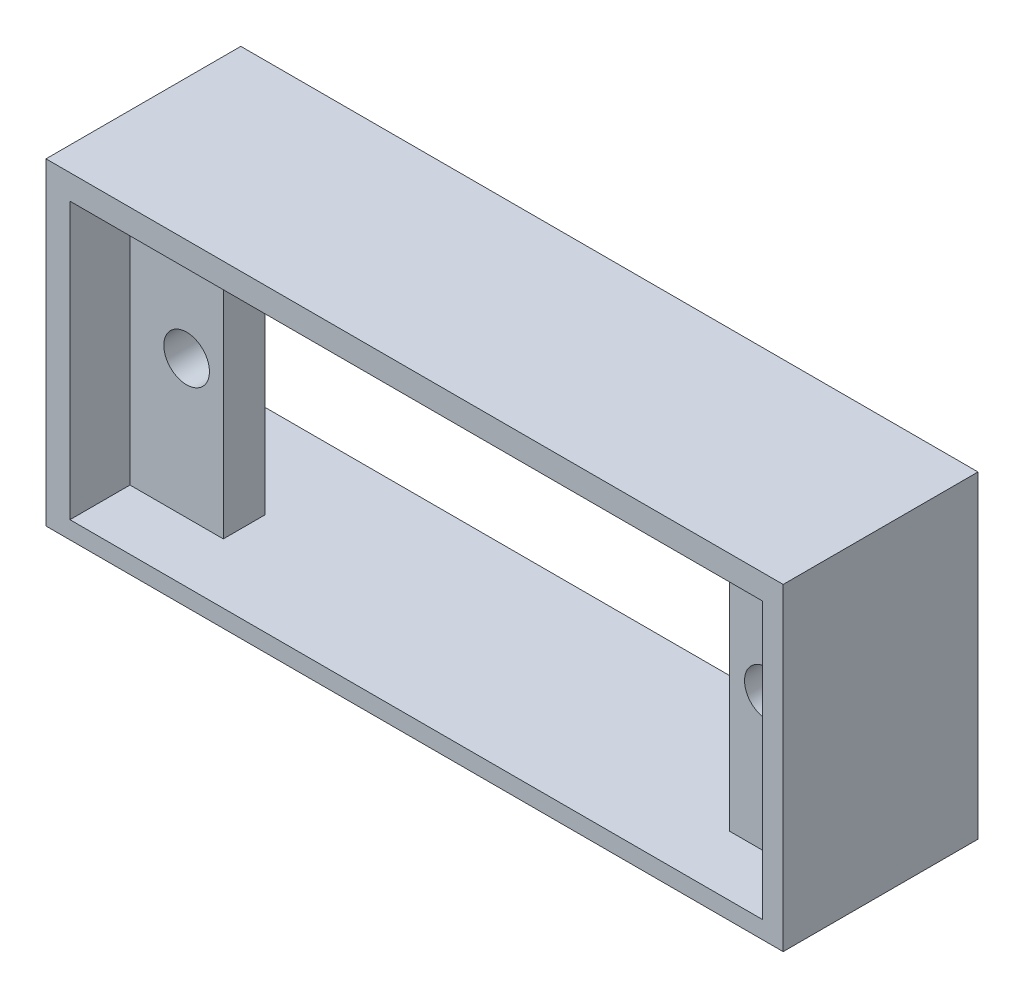
ISO-10303-21;
HEADER;
FILE_DESCRIPTION(('STEP AP214'),'2;1');
FILE_NAME('part.step','',(''),(''),'','','');
FILE_SCHEMA(('AUTOMOTIVE_DESIGN { 1 0 10303 214 1 1 1 1 }'));
ENDSEC;
DATA;
#1=APPLICATION_CONTEXT('core data for automotive mechanical design processes');
#2=APPLICATION_PROTOCOL_DEFINITION('international standard','automotive_design',2000,#1);
#3=PRODUCT_CONTEXT('',#1,'mechanical');
#4=PRODUCT('Part','Part','',(#3));
#5=PRODUCT_RELATED_PRODUCT_CATEGORY('part','',(#4));
#6=PRODUCT_DEFINITION_FORMATION('','',#4);
#7=PRODUCT_DEFINITION_CONTEXT('part definition',#1,'design');
#8=PRODUCT_DEFINITION('design','',#6,#7);
#9=PRODUCT_DEFINITION_SHAPE('','',#8);
#10=(LENGTH_UNIT() NAMED_UNIT(*) SI_UNIT(.MILLI.,.METRE.));
#11=(NAMED_UNIT(*) PLANE_ANGLE_UNIT() SI_UNIT($,.RADIAN.));
#12=(NAMED_UNIT(*) SI_UNIT($,.STERADIAN.) SOLID_ANGLE_UNIT());
#13=UNCERTAINTY_MEASURE_WITH_UNIT(LENGTH_MEASURE(1.E-05),#10,'distance_accuracy_value','');
#14=(GEOMETRIC_REPRESENTATION_CONTEXT(3) GLOBAL_UNCERTAINTY_ASSIGNED_CONTEXT((#13)) GLOBAL_UNIT_ASSIGNED_CONTEXT((#10,
#11,#12)) REPRESENTATION_CONTEXT('',''));
#15=CARTESIAN_POINT('',(0.,0.,0.));
#16=DIRECTION('',(0.,0.,1.));
#17=DIRECTION('',(1.,0.,0.));
#18=AXIS2_PLACEMENT_3D('',#15,#16,#17);
#19=CARTESIAN_POINT('',(0.,0.,0.));
#20=DIRECTION('',(0.,0.,1.));
#21=DIRECTION('',(1.,0.,0.));
#22=AXIS2_PLACEMENT_3D('',#19,#20,#21);
#23=PLANE('',#22);
#24=DIRECTION('',(1.,0.,0.));
#25=VECTOR('',#24,1.);
#26=CARTESIAN_POINT('',(133.519342789879,6.64999999999998,0.));
#27=LINE('',#26,#25);
#28=CARTESIAN_POINT('',(133.519342789879,6.64999999999998,0.));
#29=VERTEX_POINT('',#28);
#30=CARTESIAN_POINT('',(166.919342789878,6.64999999999997,0.));
#31=VERTEX_POINT('',#30);
#32=EDGE_CURVE('E272',#29,#31,#27,.T.);
#33=ORIENTED_EDGE('',*,*,#32,.F.);
#34=DIRECTION('',(0.,1.,0.));
#35=VECTOR('',#34,1.);
#36=CARTESIAN_POINT('',(133.519342789879,-6.65000000000003,0.));
#37=LINE('',#36,#35);
#38=CARTESIAN_POINT('',(133.519342789879,-6.65000000000003,0.));
#39=VERTEX_POINT('',#38);
#40=EDGE_CURVE('E241',#39,#29,#37,.T.);
#41=ORIENTED_EDGE('',*,*,#40,.F.);
#42=DIRECTION('',(-1.,0.,0.));
#43=VECTOR('',#42,1.);
#44=CARTESIAN_POINT('',(133.519342789879,-6.65000000000003,0.));
#45=LINE('',#44,#43);
#46=CARTESIAN_POINT('',(166.919342789878,-6.65000000000003,0.));
#47=VERTEX_POINT('',#46);
#48=EDGE_CURVE('E255',#47,#39,#45,.T.);
#49=ORIENTED_EDGE('',*,*,#48,.F.);
#50=DIRECTION('',(0.,-1.,0.));
#51=VECTOR('',#50,1.);
#52=CARTESIAN_POINT('',(166.919342789878,-6.65000000000003,0.));
#53=LINE('',#52,#51);
#54=EDGE_CURVE('E275',#31,#47,#53,.T.);
#55=ORIENTED_EDGE('',*,*,#54,.F.);
#56=EDGE_LOOP('',(#33,#41,#49,#55));
#57=FACE_BOUND('',#56,.T.);
#58=DIRECTION('',(-1.,0.,0.));
#59=VECTOR('',#58,1.);
#60=CARTESIAN_POINT('',(0.,-7.49377621351169,0.));
#61=LINE('',#60,#59);
#62=CARTESIAN_POINT('',(167.906074817985,-7.49377621351169,0.));
#63=VERTEX_POINT('',#62);
#64=CARTESIAN_POINT('',(132.363269097405,-7.49377621351169,0.));
#65=VERTEX_POINT('',#64);
#66=EDGE_CURVE('E348',#63,#65,#61,.T.);
#67=ORIENTED_EDGE('',*,*,#66,.T.);
#68=DIRECTION('',(0.,-1.,0.));
#69=VECTOR('',#68,1.);
#70=CARTESIAN_POINT('',(132.363269097405,0.,0.));
#71=LINE('',#70,#69);
#72=CARTESIAN_POINT('',(132.363269097405,7.84055344266233,0.));
#73=VERTEX_POINT('',#72);
#74=EDGE_CURVE('E194',#73,#65,#71,.T.);
#75=ORIENTED_EDGE('',*,*,#74,.F.);
#76=DIRECTION('',(-1.,0.,0.));
#77=VECTOR('',#76,1.);
#78=CARTESIAN_POINT('',(0.,7.84055344266233,0.));
#79=LINE('',#78,#77);
#80=CARTESIAN_POINT('',(167.906074817985,7.84055344266233,0.));
#81=VERTEX_POINT('',#80);
#82=EDGE_CURVE('E179',#81,#73,#79,.T.);
#83=ORIENTED_EDGE('',*,*,#82,.F.);
#84=DIRECTION('',(0.,-1.,0.));
#85=VECTOR('',#84,1.);
#86=CARTESIAN_POINT('',(167.906074817985,0.,0.));
#87=LINE('',#86,#85);
#88=EDGE_CURVE('E350',#81,#63,#87,.T.);
#89=ORIENTED_EDGE('',*,*,#88,.T.);
#90=EDGE_LOOP('',(#67,#75,#83,#89));
#91=FACE_BOUND('',#90,.T.);
#92=ADVANCED_FACE('F49',(#57,#91),#23,.F.);
#93=CARTESIAN_POINT('',(138.019342789879,0.,25.));
#94=DIRECTION('',(1.,0.,0.));
#95=DIRECTION('',(0.,0.,-1.));
#96=AXIS2_PLACEMENT_3D('',#93,#94,#95);
#97=PLANE('',#96);
#98=DIRECTION('',(0.,1.,0.));
#99=VECTOR('',#98,1.);
#100=CARTESIAN_POINT('',(138.019342789879,0.,6.5));
#101=LINE('',#100,#99);
#102=CARTESIAN_POINT('',(138.019342789879,-6.65000000000003,6.5));
#103=VERTEX_POINT('',#102);
#104=CARTESIAN_POINT('',(138.019342789879,6.64999999999998,6.5));
#105=VERTEX_POINT('',#104);
#106=EDGE_CURVE('E226',#103,#105,#101,.T.);
#107=ORIENTED_EDGE('',*,*,#106,.F.);
#108=DIRECTION('',(0.,0.,-1.));
#109=VECTOR('',#108,1.);
#110=CARTESIAN_POINT('',(138.019342789879,-6.65000000000003,25.));
#111=LINE('',#110,#109);
#112=CARTESIAN_POINT('',(138.019342789879,-6.65000000000003,4.5));
#113=VERTEX_POINT('',#112);
#114=EDGE_CURVE('E238',#103,#113,#111,.T.);
#115=ORIENTED_EDGE('',*,*,#114,.T.);
#116=DIRECTION('',(0.,-1.,0.));
#117=VECTOR('',#116,1.);
#118=CARTESIAN_POINT('',(138.019342789879,0.,4.5));
#119=LINE('',#118,#117);
#120=CARTESIAN_POINT('',(138.019342789879,6.64999999999998,4.5));
#121=VERTEX_POINT('',#120);
#122=EDGE_CURVE('E299',#121,#113,#119,.T.);
#123=ORIENTED_EDGE('',*,*,#122,.F.);
#124=DIRECTION('',(0.,0.,-1.));
#125=VECTOR('',#124,1.);
#126=CARTESIAN_POINT('',(138.019342789879,6.64999999999998,25.));
#127=LINE('',#126,#125);
#128=EDGE_CURVE('E237',#105,#121,#127,.T.);
#129=ORIENTED_EDGE('',*,*,#128,.F.);
#130=EDGE_LOOP('',(#107,#115,#123,#129));
#131=FACE_BOUND('',#130,.T.);
#132=ADVANCED_FACE('F332',(#131),#97,.T.);
#133=CARTESIAN_POINT('',(0.,0.,4.5));
#134=DIRECTION('',(0.,0.,-1.));
#135=DIRECTION('',(-1.,0.,0.));
#136=AXIS2_PLACEMENT_3D('',#133,#134,#135);
#137=PLANE('',#136);
#138=CARTESIAN_POINT('',(136.249999956768,0.,4.5));
#139=DIRECTION('',(0.,0.,-1.));
#140=DIRECTION('',(-1.,0.,0.));
#141=AXIS2_PLACEMENT_3D('',#138,#139,#140);
#142=CIRCLE('',#141,1.09999999999999);
#143=CARTESIAN_POINT('',(135.149999956768,0.,4.5));
#144=VERTEX_POINT('',#143);
#145=EDGE_CURVE('E200',#144,#144,#142,.T.);
#146=ORIENTED_EDGE('',*,*,#145,.F.);
#147=EDGE_LOOP('',(#146));
#148=FACE_BOUND('',#147,.T.);
#149=DIRECTION('',(1.,0.,0.));
#150=VECTOR('',#149,1.);
#151=CARTESIAN_POINT('',(133.519342789879,6.64999999999998,4.5));
#152=LINE('',#151,#150);
#153=CARTESIAN_POINT('',(133.519342789879,6.64999999999998,4.5));
#154=VERTEX_POINT('',#153);
#155=EDGE_CURVE('E256',#154,#121,#152,.T.);
#156=ORIENTED_EDGE('',*,*,#155,.T.);
#157=ORIENTED_EDGE('',*,*,#122,.T.);
#158=DIRECTION('',(-1.,0.,0.));
#159=VECTOR('',#158,1.);
#160=CARTESIAN_POINT('',(133.519342789879,-6.65000000000003,4.5));
#161=LINE('',#160,#159);
#162=CARTESIAN_POINT('',(133.519342789879,-6.65000000000003,4.5));
#163=VERTEX_POINT('',#162);
#164=EDGE_CURVE('E264',#113,#163,#161,.T.);
#165=ORIENTED_EDGE('',*,*,#164,.T.);
#166=DIRECTION('',(0.,1.,0.));
#167=VECTOR('',#166,1.);
#168=CARTESIAN_POINT('',(133.519342789879,-6.65000000000003,4.5));
#169=LINE('',#168,#167);
#170=EDGE_CURVE('E250',#163,#154,#169,.T.);
#171=ORIENTED_EDGE('',*,*,#170,.T.);
#172=EDGE_LOOP('',(#156,#157,#165,#171));
#173=FACE_BOUND('',#172,.T.);
#174=ADVANCED_FACE('F338',(#148,#173),#137,.T.);
#175=CARTESIAN_POINT('',(133.519342789879,-6.65000000000003,4.5));
#176=DIRECTION('',(-1.,0.,0.));
#177=DIRECTION('',(0.,0.,1.));
#178=AXIS2_PLACEMENT_3D('',#175,#176,#177);
#179=PLANE('',#178);
#180=ORIENTED_EDGE('',*,*,#40,.T.);
#181=DIRECTION('',(0.,0.,-1.));
#182=VECTOR('',#181,1.);
#183=CARTESIAN_POINT('',(133.519342789879,6.64999999999998,4.5));
#184=LINE('',#183,#182);
#185=EDGE_CURVE('E269',#154,#29,#184,.T.);
#186=ORIENTED_EDGE('',*,*,#185,.F.);
#187=ORIENTED_EDGE('',*,*,#170,.F.);
#188=DIRECTION('',(0.,0.,-1.));
#189=VECTOR('',#188,1.);
#190=CARTESIAN_POINT('',(133.519342789879,-6.65000000000003,4.5));
#191=LINE('',#190,#189);
#192=EDGE_CURVE('E281',#163,#39,#191,.T.);
#193=ORIENTED_EDGE('',*,*,#192,.T.);
#194=EDGE_LOOP('',(#180,#186,#187,#193));
#195=FACE_BOUND('',#194,.T.);
#196=ADVANCED_FACE('F405',(#195),#179,.F.);
#197=CARTESIAN_POINT('',(133.519342789879,-6.65000000000003,4.5));
#198=DIRECTION('',(0.,-1.,0.));
#199=DIRECTION('',(1.,0.,0.));
#200=AXIS2_PLACEMENT_3D('',#197,#198,#199);
#201=PLANE('',#200);
#202=DIRECTION('',(0.,0.,-1.));
#203=VECTOR('',#202,1.);
#204=CARTESIAN_POINT('',(133.519342789878,-6.65000000000003,25.));
#205=LINE('',#204,#203);
#206=CARTESIAN_POINT('',(133.519342789878,-6.65000000000003,9.39360840973166));
#207=VERTEX_POINT('',#206);
#208=CARTESIAN_POINT('',(133.519342789878,-6.65000000000003,6.5));
#209=VERTEX_POINT('',#208);
#210=EDGE_CURVE('E230',#207,#209,#205,.T.);
#211=ORIENTED_EDGE('',*,*,#210,.F.);
#212=DIRECTION('',(1.,0.,0.));
#213=VECTOR('',#212,1.);
#214=CARTESIAN_POINT('',(133.519342789879,-6.65000000000003,9.39360840973166));
#215=LINE('',#214,#213);
#216=CARTESIAN_POINT('',(166.919342789878,-6.65000000000003,9.39360840973166));
#217=VERTEX_POINT('',#216);
#218=EDGE_CURVE('E359',#207,#217,#215,.T.);
#219=ORIENTED_EDGE('',*,*,#218,.T.);
#220=DIRECTION('',(0.,0.,-1.));
#221=VECTOR('',#220,1.);
#222=CARTESIAN_POINT('',(166.919342789878,-6.65000000000003,25.));
#223=LINE('',#222,#221);
#224=CARTESIAN_POINT('',(166.919342789878,-6.65000000000003,6.5));
#225=VERTEX_POINT('',#224);
#226=EDGE_CURVE('E222',#217,#225,#223,.T.);
#227=ORIENTED_EDGE('',*,*,#226,.T.);
#228=DIRECTION('',(-1.,0.,0.));
#229=VECTOR('',#228,1.);
#230=CARTESIAN_POINT('',(166.919342789878,-6.65000000000003,6.5));
#231=LINE('',#230,#229);
#232=CARTESIAN_POINT('',(162.419342789878,-6.65000000000003,6.5));
#233=VERTEX_POINT('',#232);
#234=EDGE_CURVE('E209',#225,#233,#231,.T.);
#235=ORIENTED_EDGE('',*,*,#234,.T.);
#236=DIRECTION('',(0.,0.,-1.));
#237=VECTOR('',#236,1.);
#238=CARTESIAN_POINT('',(162.419342789878,-6.65000000000003,25.));
#239=LINE('',#238,#237);
#240=CARTESIAN_POINT('',(162.419342789878,-6.65000000000003,4.5));
#241=VERTEX_POINT('',#240);
#242=EDGE_CURVE('E242',#233,#241,#239,.T.);
#243=ORIENTED_EDGE('',*,*,#242,.T.);
#244=CARTESIAN_POINT('',(166.919342789878,-6.65000000000003,4.5));
#245=VERTEX_POINT('',#244);
#246=EDGE_CURVE('E265',#245,#241,#161,.T.);
#247=ORIENTED_EDGE('',*,*,#246,.F.);
#248=DIRECTION('',(0.,0.,-1.));
#249=VECTOR('',#248,1.);
#250=CARTESIAN_POINT('',(166.919342789878,-6.65000000000003,4.5));
#251=LINE('',#250,#249);
#252=EDGE_CURVE('E286',#245,#47,#251,.T.);
#253=ORIENTED_EDGE('',*,*,#252,.T.);
#254=ORIENTED_EDGE('',*,*,#48,.T.);
#255=ORIENTED_EDGE('',*,*,#192,.F.);
#256=ORIENTED_EDGE('',*,*,#164,.F.);
#257=ORIENTED_EDGE('',*,*,#114,.F.);
#258=EDGE_CURVE('E208',#103,#209,#231,.T.);
#259=ORIENTED_EDGE('',*,*,#258,.T.);
#260=EDGE_LOOP('',(#211,#219,#227,#235,#243,#247,#253,#254,#255,#256,#257,#259));
#261=FACE_BOUND('',#260,.T.);
#262=ADVANCED_FACE('F391',(#261),#201,.F.);
#263=CARTESIAN_POINT('',(166.919342789878,-6.65000000000003,4.5));
#264=DIRECTION('',(1.,0.,0.));
#265=DIRECTION('',(0.,0.,-1.));
#266=AXIS2_PLACEMENT_3D('',#263,#264,#265);
#267=PLANE('',#266);
#268=ORIENTED_EDGE('',*,*,#54,.T.);
#269=ORIENTED_EDGE('',*,*,#252,.F.);
#270=DIRECTION('',(0.,-1.,0.));
#271=VECTOR('',#270,1.);
#272=CARTESIAN_POINT('',(166.919342789878,-6.65000000000003,4.5));
#273=LINE('',#272,#271);
#274=CARTESIAN_POINT('',(166.919342789878,6.64999999999997,4.5));
#275=VERTEX_POINT('',#274);
#276=EDGE_CURVE('E260',#275,#245,#273,.T.);
#277=ORIENTED_EDGE('',*,*,#276,.F.);
#278=DIRECTION('',(0.,0.,-1.));
#279=VECTOR('',#278,1.);
#280=CARTESIAN_POINT('',(166.919342789878,6.64999999999997,4.5));
#281=LINE('',#280,#279);
#282=EDGE_CURVE('E289',#275,#31,#281,.T.);
#283=ORIENTED_EDGE('',*,*,#282,.T.);
#284=EDGE_LOOP('',(#268,#269,#277,#283));
#285=FACE_BOUND('',#284,.T.);
#286=ADVANCED_FACE('F402',(#285),#267,.F.);
#287=CARTESIAN_POINT('',(133.519342789879,6.64999999999998,4.5));
#288=DIRECTION('',(0.,1.,0.));
#289=DIRECTION('',(-1.,0.,0.));
#290=AXIS2_PLACEMENT_3D('',#287,#288,#289);
#291=PLANE('',#290);
#292=DIRECTION('',(0.,0.,-1.));
#293=VECTOR('',#292,1.);
#294=CARTESIAN_POINT('',(166.919342789878,6.64999999999998,25.));
#295=LINE('',#294,#293);
#296=CARTESIAN_POINT('',(166.919342789878,6.64999999999998,9.39360840973166));
#297=VERTEX_POINT('',#296);
#298=CARTESIAN_POINT('',(166.919342789878,6.64999999999998,6.5));
#299=VERTEX_POINT('',#298);
#300=EDGE_CURVE('E223',#297,#299,#295,.T.);
#301=ORIENTED_EDGE('',*,*,#300,.F.);
#302=DIRECTION('',(-1.,0.,0.));
#303=VECTOR('',#302,1.);
#304=CARTESIAN_POINT('',(133.519342789879,6.64999999999998,9.39360840973166));
#305=LINE('',#304,#303);
#306=CARTESIAN_POINT('',(133.519342789878,6.64999999999998,9.39360840973166));
#307=VERTEX_POINT('',#306);
#308=EDGE_CURVE('E64',#297,#307,#305,.T.);
#309=ORIENTED_EDGE('',*,*,#308,.T.);
#310=DIRECTION('',(0.,0.,-1.));
#311=VECTOR('',#310,1.);
#312=CARTESIAN_POINT('',(133.519342789878,6.64999999999998,25.));
#313=LINE('',#312,#311);
#314=CARTESIAN_POINT('',(133.519342789878,6.64999999999998,6.5));
#315=VERTEX_POINT('',#314);
#316=EDGE_CURVE('E227',#307,#315,#313,.T.);
#317=ORIENTED_EDGE('',*,*,#316,.T.);
#318=DIRECTION('',(1.,0.,0.));
#319=VECTOR('',#318,1.);
#320=CARTESIAN_POINT('',(166.919342789878,6.64999999999998,6.5));
#321=LINE('',#320,#319);
#322=EDGE_CURVE('E218',#315,#105,#321,.T.);
#323=ORIENTED_EDGE('',*,*,#322,.T.);
#324=ORIENTED_EDGE('',*,*,#128,.T.);
#325=ORIENTED_EDGE('',*,*,#155,.F.);
#326=ORIENTED_EDGE('',*,*,#185,.T.);
#327=ORIENTED_EDGE('',*,*,#32,.T.);
#328=ORIENTED_EDGE('',*,*,#282,.F.);
#329=CARTESIAN_POINT('',(162.419342789878,6.64999999999997,4.5));
#330=VERTEX_POINT('',#329);
#331=EDGE_CURVE('E254',#330,#275,#152,.T.);
#332=ORIENTED_EDGE('',*,*,#331,.F.);
#333=DIRECTION('',(0.,0.,-1.));
#334=VECTOR('',#333,1.);
#335=CARTESIAN_POINT('',(162.419342789878,6.64999999999997,25.));
#336=LINE('',#335,#334);
#337=CARTESIAN_POINT('',(162.419342789878,6.64999999999997,6.5));
#338=VERTEX_POINT('',#337);
#339=EDGE_CURVE('E245',#338,#330,#336,.T.);
#340=ORIENTED_EDGE('',*,*,#339,.F.);
#341=EDGE_CURVE('E217',#338,#299,#321,.T.);
#342=ORIENTED_EDGE('',*,*,#341,.T.);
#343=EDGE_LOOP('',(#301,#309,#317,#323,#324,#325,#326,#327,#328,#332,#340,#342));
#344=FACE_BOUND('',#343,.T.);
#345=ADVANCED_FACE('F379',(#344),#291,.F.);
#346=CARTESIAN_POINT('',(164.249999956768,0.,4.5));
#347=DIRECTION('',(0.,0.,-1.));
#348=DIRECTION('',(-1.,0.,0.));
#349=AXIS2_PLACEMENT_3D('',#346,#347,#348);
#350=CIRCLE('',#349,1.09999999999999);
#351=CARTESIAN_POINT('',(163.149999956768,0.,4.5));
#352=VERTEX_POINT('',#351);
#353=EDGE_CURVE('E195',#352,#352,#350,.T.);
#354=ORIENTED_EDGE('',*,*,#353,.F.);
#355=EDGE_LOOP('',(#354));
#356=FACE_BOUND('',#355,.T.);
#357=DIRECTION('',(0.,-1.,0.));
#358=VECTOR('',#357,1.);
#359=CARTESIAN_POINT('',(162.419342789878,0.,4.5));
#360=LINE('',#359,#358);
#361=EDGE_CURVE('E285',#330,#241,#360,.T.);
#362=ORIENTED_EDGE('',*,*,#361,.F.);
#363=ORIENTED_EDGE('',*,*,#331,.T.);
#364=ORIENTED_EDGE('',*,*,#276,.T.);
#365=ORIENTED_EDGE('',*,*,#246,.T.);
#366=EDGE_LOOP('',(#362,#363,#364,#365));
#367=FACE_BOUND('',#366,.T.);
#368=ADVANCED_FACE('F397',(#356,#367),#137,.T.);
#369=CARTESIAN_POINT('',(162.419342789878,0.,25.));
#370=DIRECTION('',(1.,0.,0.));
#371=DIRECTION('',(0.,0.,-1.));
#372=AXIS2_PLACEMENT_3D('',#369,#370,#371);
#373=PLANE('',#372);
#374=ORIENTED_EDGE('',*,*,#242,.F.);
#375=DIRECTION('',(0.,1.,0.));
#376=VECTOR('',#375,1.);
#377=CARTESIAN_POINT('',(162.419342789878,0.,6.5));
#378=LINE('',#377,#376);
#379=EDGE_CURVE('E57',#233,#338,#378,.T.);
#380=ORIENTED_EDGE('',*,*,#379,.T.);
#381=ORIENTED_EDGE('',*,*,#339,.T.);
#382=ORIENTED_EDGE('',*,*,#361,.T.);
#383=EDGE_LOOP('',(#374,#380,#381,#382));
#384=FACE_BOUND('',#383,.T.);
#385=ADVANCED_FACE('F394',(#384),#373,.F.);
#386=CARTESIAN_POINT('',(133.519342789878,6.64999999999998,25.));
#387=DIRECTION('',(-1.,0.,0.));
#388=DIRECTION('',(0.,0.,1.));
#389=AXIS2_PLACEMENT_3D('',#386,#387,#388);
#390=PLANE('',#389);
#391=ORIENTED_EDGE('',*,*,#316,.F.);
#392=DIRECTION('',(0.,-1.,0.));
#393=VECTOR('',#392,1.);
#394=CARTESIAN_POINT('',(133.519342789878,6.64999999999998,9.39360840973166));
#395=LINE('',#394,#393);
#396=EDGE_CURVE('E353',#307,#207,#395,.T.);
#397=ORIENTED_EDGE('',*,*,#396,.T.);
#398=ORIENTED_EDGE('',*,*,#210,.T.);
#399=DIRECTION('',(0.,1.,0.));
#400=VECTOR('',#399,1.);
#401=CARTESIAN_POINT('',(133.519342789878,6.64999999999998,6.5));
#402=LINE('',#401,#400);
#403=EDGE_CURVE('E213',#209,#315,#402,.T.);
#404=ORIENTED_EDGE('',*,*,#403,.T.);
#405=EDGE_LOOP('',(#391,#397,#398,#404));
#406=FACE_BOUND('',#405,.T.);
#407=ADVANCED_FACE('F421',(#406),#390,.F.);
#408=CARTESIAN_POINT('',(0.,0.,6.5));
#409=DIRECTION('',(0.,0.,-1.));
#410=DIRECTION('',(-1.,0.,0.));
#411=AXIS2_PLACEMENT_3D('',#408,#409,#410);
#412=PLANE('',#411);
#413=CARTESIAN_POINT('',(136.249999956768,0.,6.5));
#414=DIRECTION('',(0.,0.,-1.));
#415=DIRECTION('',(-1.,0.,0.));
#416=AXIS2_PLACEMENT_3D('',#413,#414,#415);
#417=CIRCLE('',#416,1.09999999999999);
#418=CARTESIAN_POINT('',(135.149999956768,0.,6.5));
#419=VERTEX_POINT('',#418);
#420=EDGE_CURVE('E199',#419,#419,#417,.T.);
#421=ORIENTED_EDGE('',*,*,#420,.T.);
#422=EDGE_LOOP('',(#421));
#423=FACE_BOUND('',#422,.T.);
#424=ORIENTED_EDGE('',*,*,#106,.T.);
#425=ORIENTED_EDGE('',*,*,#322,.F.);
#426=ORIENTED_EDGE('',*,*,#403,.F.);
#427=ORIENTED_EDGE('',*,*,#258,.F.);
#428=EDGE_LOOP('',(#424,#425,#426,#427));
#429=FACE_BOUND('',#428,.T.);
#430=ADVANCED_FACE('F312',(#423,#429),#412,.F.);
#431=CARTESIAN_POINT('',(164.249999956768,0.,6.5));
#432=DIRECTION('',(0.,0.,-1.));
#433=DIRECTION('',(-1.,0.,0.));
#434=AXIS2_PLACEMENT_3D('',#431,#432,#433);
#435=CIRCLE('',#434,1.09999999999999);
#436=CARTESIAN_POINT('',(163.149999956768,0.,6.5));
#437=VERTEX_POINT('',#436);
#438=EDGE_CURVE('E186',#437,#437,#435,.T.);
#439=ORIENTED_EDGE('',*,*,#438,.T.);
#440=EDGE_LOOP('',(#439));
#441=FACE_BOUND('',#440,.T.);
#442=ORIENTED_EDGE('',*,*,#234,.F.);
#443=DIRECTION('',(0.,-1.,0.));
#444=VECTOR('',#443,1.);
#445=CARTESIAN_POINT('',(166.919342789878,6.64999999999998,6.5));
#446=LINE('',#445,#444);
#447=EDGE_CURVE('E204',#299,#225,#446,.T.);
#448=ORIENTED_EDGE('',*,*,#447,.F.);
#449=ORIENTED_EDGE('',*,*,#341,.F.);
#450=ORIENTED_EDGE('',*,*,#379,.F.);
#451=EDGE_LOOP('',(#442,#448,#449,#450));
#452=FACE_BOUND('',#451,.T.);
#453=ADVANCED_FACE('F387',(#441,#452),#412,.F.);
#454=CARTESIAN_POINT('',(166.919342789878,6.64999999999998,25.));
#455=DIRECTION('',(1.,0.,0.));
#456=DIRECTION('',(0.,0.,-1.));
#457=AXIS2_PLACEMENT_3D('',#454,#455,#456);
#458=PLANE('',#457);
#459=ORIENTED_EDGE('',*,*,#226,.F.);
#460=DIRECTION('',(0.,1.,0.));
#461=VECTOR('',#460,1.);
#462=CARTESIAN_POINT('',(166.919342789878,6.64999999999998,9.39360840973166));
#463=LINE('',#462,#461);
#464=EDGE_CURVE('E370',#217,#297,#463,.T.);
#465=ORIENTED_EDGE('',*,*,#464,.T.);
#466=ORIENTED_EDGE('',*,*,#300,.T.);
#467=ORIENTED_EDGE('',*,*,#447,.T.);
#468=EDGE_LOOP('',(#459,#465,#466,#467));
#469=FACE_BOUND('',#468,.T.);
#470=ADVANCED_FACE('F328',(#469),#458,.F.);
#471=CARTESIAN_POINT('',(164.249999956768,0.,25.));
#472=DIRECTION('',(0.,0.,-1.));
#473=DIRECTION('',(-1.,0.,0.));
#474=AXIS2_PLACEMENT_3D('',#471,#472,#473);
#475=CYLINDRICAL_SURFACE('',#474,1.09999999999999);
#476=ORIENTED_EDGE('',*,*,#353,.T.);
#477=EDGE_LOOP('',(#476));
#478=FACE_BOUND('',#477,.T.);
#479=ORIENTED_EDGE('',*,*,#438,.F.);
#480=EDGE_LOOP('',(#479));
#481=FACE_BOUND('',#480,.T.);
#482=ADVANCED_FACE('F318',(#478,#481),#475,.F.);
#483=CARTESIAN_POINT('',(136.249999956768,0.,25.));
#484=DIRECTION('',(0.,0.,-1.));
#485=DIRECTION('',(-1.,0.,0.));
#486=AXIS2_PLACEMENT_3D('',#483,#484,#485);
#487=CYLINDRICAL_SURFACE('',#486,1.09999999999999);
#488=ORIENTED_EDGE('',*,*,#145,.T.);
#489=EDGE_LOOP('',(#488));
#490=FACE_BOUND('',#489,.T.);
#491=ORIENTED_EDGE('',*,*,#420,.F.);
#492=EDGE_LOOP('',(#491));
#493=FACE_BOUND('',#492,.T.);
#494=ADVANCED_FACE('F315',(#490,#493),#487,.F.);
#495=CARTESIAN_POINT('',(0.,-7.49377621351169,25.));
#496=DIRECTION('',(0.,-1.,0.));
#497=DIRECTION('',(0.,0.,-1.));
#498=AXIS2_PLACEMENT_3D('',#495,#496,#497);
#499=PLANE('',#498);
#500=DIRECTION('',(1.,0.,0.));
#501=VECTOR('',#500,1.);
#502=CARTESIAN_POINT('',(0.,-7.49377621351169,9.39360840973166));
#503=LINE('',#502,#501);
#504=CARTESIAN_POINT('',(132.363269097405,-7.49377621351169,9.39360840973166));
#505=VERTEX_POINT('',#504);
#506=CARTESIAN_POINT('',(167.906074817985,-7.49377621351169,9.39360840973166));
#507=VERTEX_POINT('',#506);
#508=EDGE_CURVE('E71',#505,#507,#503,.T.);
#509=ORIENTED_EDGE('',*,*,#508,.F.);
#510=DIRECTION('',(0.,0.,-1.));
#511=VECTOR('',#510,1.);
#512=CARTESIAN_POINT('',(132.363269097405,-7.49377621351169,25.));
#513=LINE('',#512,#511);
#514=EDGE_CURVE('E174',#505,#65,#513,.T.);
#515=ORIENTED_EDGE('',*,*,#514,.T.);
#516=ORIENTED_EDGE('',*,*,#66,.F.);
#517=DIRECTION('',(0.,0.,-1.));
#518=VECTOR('',#517,1.);
#519=CARTESIAN_POINT('',(167.906074817985,-7.49377621351169,25.));
#520=LINE('',#519,#518);
#521=EDGE_CURVE('E188',#507,#63,#520,.T.);
#522=ORIENTED_EDGE('',*,*,#521,.F.);
#523=EDGE_LOOP('',(#509,#515,#516,#522));
#524=FACE_BOUND('',#523,.T.);
#525=ADVANCED_FACE('F317',(#524),#499,.T.);
#526=CARTESIAN_POINT('',(132.363269097405,0.,25.));
#527=DIRECTION('',(1.,0.,0.));
#528=DIRECTION('',(0.,0.,-1.));
#529=AXIS2_PLACEMENT_3D('',#526,#527,#528);
#530=PLANE('',#529);
#531=ORIENTED_EDGE('',*,*,#514,.F.);
#532=DIRECTION('',(0.,-1.,0.));
#533=VECTOR('',#532,1.);
#534=CARTESIAN_POINT('',(132.363269097405,10.2373279359164,9.39360840973166));
#535=LINE('',#534,#533);
#536=CARTESIAN_POINT('',(132.363269097405,7.84055344266233,9.39360840973166));
#537=VERTEX_POINT('',#536);
#538=EDGE_CURVE('E162',#537,#505,#535,.T.);
#539=ORIENTED_EDGE('',*,*,#538,.F.);
#540=DIRECTION('',(0.,0.,-1.));
#541=VECTOR('',#540,1.);
#542=CARTESIAN_POINT('',(132.363269097405,7.84055344266233,25.));
#543=LINE('',#542,#541);
#544=EDGE_CURVE('E172',#537,#73,#543,.T.);
#545=ORIENTED_EDGE('',*,*,#544,.T.);
#546=ORIENTED_EDGE('',*,*,#74,.T.);
#547=EDGE_LOOP('',(#531,#539,#545,#546));
#548=FACE_BOUND('',#547,.T.);
#549=ADVANCED_FACE('F170',(#548),#530,.F.);
#550=CARTESIAN_POINT('',(0.,7.84055344266233,25.));
#551=DIRECTION('',(0.,-1.,0.));
#552=DIRECTION('',(0.,0.,-1.));
#553=AXIS2_PLACEMENT_3D('',#550,#551,#552);
#554=PLANE('',#553);
#555=ORIENTED_EDGE('',*,*,#544,.F.);
#556=DIRECTION('',(1.,0.,0.));
#557=VECTOR('',#556,1.);
#558=CARTESIAN_POINT('',(0.,7.84055344266233,9.39360840973166));
#559=LINE('',#558,#557);
#560=CARTESIAN_POINT('',(167.906074817985,7.84055344266233,9.39360840973166));
#561=VERTEX_POINT('',#560);
#562=EDGE_CURVE('E159',#537,#561,#559,.T.);
#563=ORIENTED_EDGE('',*,*,#562,.T.);
#564=DIRECTION('',(0.,0.,-1.));
#565=VECTOR('',#564,1.);
#566=CARTESIAN_POINT('',(167.906074817985,7.84055344266233,25.));
#567=LINE('',#566,#565);
#568=EDGE_CURVE('E182',#561,#81,#567,.T.);
#569=ORIENTED_EDGE('',*,*,#568,.T.);
#570=ORIENTED_EDGE('',*,*,#82,.T.);
#571=EDGE_LOOP('',(#555,#563,#569,#570));
#572=FACE_BOUND('',#571,.T.);
#573=ADVANCED_FACE('F177',(#572),#554,.F.);
#574=CARTESIAN_POINT('',(167.906074817985,0.,25.));
#575=DIRECTION('',(1.,0.,0.));
#576=DIRECTION('',(0.,0.,-1.));
#577=AXIS2_PLACEMENT_3D('',#574,#575,#576);
#578=PLANE('',#577);
#579=DIRECTION('',(0.,1.,0.));
#580=VECTOR('',#579,1.);
#581=CARTESIAN_POINT('',(167.906074817985,0.,9.39360840973166));
#582=LINE('',#581,#580);
#583=EDGE_CURVE('E12',#507,#561,#582,.T.);
#584=ORIENTED_EDGE('',*,*,#583,.F.);
#585=ORIENTED_EDGE('',*,*,#521,.T.);
#586=ORIENTED_EDGE('',*,*,#88,.F.);
#587=ORIENTED_EDGE('',*,*,#568,.F.);
#588=EDGE_LOOP('',(#584,#585,#586,#587));
#589=FACE_BOUND('',#588,.T.);
#590=ADVANCED_FACE('F423',(#589),#578,.T.);
#591=CARTESIAN_POINT('',(167.906074817985,10.2373279359164,9.39360840973166));
#592=DIRECTION('',(0.,0.,-1.));
#593=DIRECTION('',(-1.,0.,0.));
#594=AXIS2_PLACEMENT_3D('',#591,#592,#593);
#595=PLANE('',#594);
#596=ORIENTED_EDGE('',*,*,#508,.T.);
#597=ORIENTED_EDGE('',*,*,#583,.T.);
#598=ORIENTED_EDGE('',*,*,#562,.F.);
#599=ORIENTED_EDGE('',*,*,#538,.T.);
#600=EDGE_LOOP('',(#596,#597,#598,#599));
#601=FACE_BOUND('',#600,.T.);
#602=ORIENTED_EDGE('',*,*,#308,.F.);
#603=ORIENTED_EDGE('',*,*,#464,.F.);
#604=ORIENTED_EDGE('',*,*,#218,.F.);
#605=ORIENTED_EDGE('',*,*,#396,.F.);
#606=EDGE_LOOP('',(#602,#603,#604,#605));
#607=FACE_BOUND('',#606,.T.);
#608=ADVANCED_FACE('F161',(#601,#607),#595,.F.);
#609=CLOSED_SHELL('',(#92,#132,#174,#196,#262,#286,#345,#368,#385,#407,#430,#453,#470,#482,#494,
#525,#549,#573,#590,#608));
#610=MANIFOLD_SOLID_BREP('B2',#609);
#611=ADVANCED_BREP_SHAPE_REPRESENTATION('',(#18,#610),#14);
#612=SHAPE_DEFINITION_REPRESENTATION(#9,#611);
ENDSEC;
END-ISO-10303-21;
